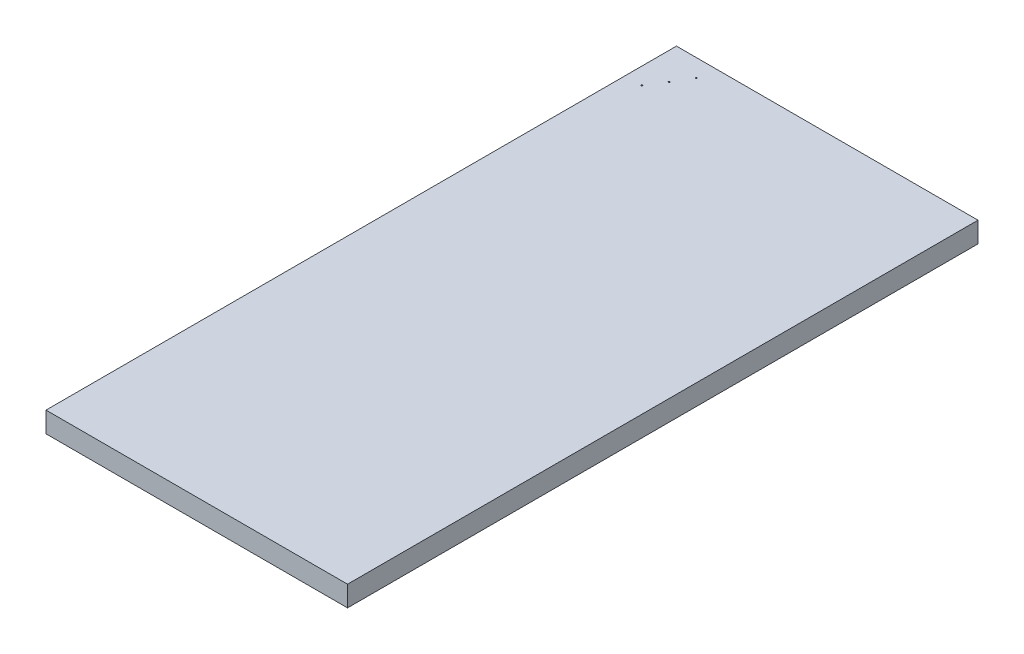
ISO-10303-21;
HEADER;
FILE_DESCRIPTION(('STEP AP214'),'2;1');
FILE_NAME('part.step','',(''),(''),'','','');
FILE_SCHEMA(('AUTOMOTIVE_DESIGN { 1 0 10303 214 1 1 1 1 }'));
ENDSEC;
DATA;
#1=APPLICATION_CONTEXT('core data for automotive mechanical design processes');
#2=APPLICATION_PROTOCOL_DEFINITION('international standard','automotive_design',2000,#1);
#3=PRODUCT_CONTEXT('',#1,'mechanical');
#4=PRODUCT('Part','Part','',(#3));
#5=PRODUCT_RELATED_PRODUCT_CATEGORY('part','',(#4));
#6=PRODUCT_DEFINITION_FORMATION('','',#4);
#7=PRODUCT_DEFINITION_CONTEXT('part definition',#1,'design');
#8=PRODUCT_DEFINITION('design','',#6,#7);
#9=PRODUCT_DEFINITION_SHAPE('','',#8);
#10=(LENGTH_UNIT() NAMED_UNIT(*) SI_UNIT(.MILLI.,.METRE.));
#11=(NAMED_UNIT(*) PLANE_ANGLE_UNIT() SI_UNIT($,.RADIAN.));
#12=(NAMED_UNIT(*) SI_UNIT($,.STERADIAN.) SOLID_ANGLE_UNIT());
#13=UNCERTAINTY_MEASURE_WITH_UNIT(LENGTH_MEASURE(1.E-05),#10,'distance_accuracy_value','');
#14=(GEOMETRIC_REPRESENTATION_CONTEXT(3) GLOBAL_UNCERTAINTY_ASSIGNED_CONTEXT((#13)) GLOBAL_UNIT_ASSIGNED_CONTEXT((#10,
#11,#12)) REPRESENTATION_CONTEXT('',''));
#15=CARTESIAN_POINT('',(0.,0.,0.));
#16=DIRECTION('',(0.,0.,1.));
#17=DIRECTION('',(1.,0.,0.));
#18=AXIS2_PLACEMENT_3D('',#15,#16,#17);
#19=CARTESIAN_POINT('',(-139.28790560472,19.05,-131.252064896755));
#20=DIRECTION('',(1.,0.,0.));
#21=DIRECTION('',(0.,0.,-1.));
#22=AXIS2_PLACEMENT_3D('',#19,#20,#21);
#23=PLANE('',#22);
#24=DIRECTION('',(0.,0.,1.));
#25=VECTOR('',#24,1.);
#26=CARTESIAN_POINT('',(-139.28790560472,0.,-131.252064896755));
#27=LINE('',#26,#25);
#28=CARTESIAN_POINT('',(-139.28790560472,0.,-131.252064896755));
#29=VERTEX_POINT('',#28);
#30=CARTESIAN_POINT('',(-139.28790560472,0.,452.947935103245));
#31=VERTEX_POINT('',#30);
#32=EDGE_CURVE('E102',#29,#31,#27,.T.);
#33=ORIENTED_EDGE('',*,*,#32,.T.);
#34=DIRECTION('',(0.,-1.,0.));
#35=VECTOR('',#34,1.);
#36=CARTESIAN_POINT('',(-139.28790560472,19.05,452.947935103245));
#37=LINE('',#36,#35);
#38=CARTESIAN_POINT('',(-139.28790560472,19.05,452.947935103245));
#39=VERTEX_POINT('',#38);
#40=EDGE_CURVE('E11',#39,#31,#37,.T.);
#41=ORIENTED_EDGE('',*,*,#40,.F.);
#42=DIRECTION('',(0.,0.,1.));
#43=VECTOR('',#42,1.);
#44=CARTESIAN_POINT('',(-139.28790560472,19.05,-131.252064896755));
#45=LINE('',#44,#43);
#46=CARTESIAN_POINT('',(-139.28790560472,19.05,-131.252064896755));
#47=VERTEX_POINT('',#46);
#48=EDGE_CURVE('E90',#47,#39,#45,.T.);
#49=ORIENTED_EDGE('',*,*,#48,.F.);
#50=DIRECTION('',(0.,-1.,0.));
#51=VECTOR('',#50,1.);
#52=CARTESIAN_POINT('',(-139.28790560472,19.05,-131.252064896755));
#53=LINE('',#52,#51);
#54=EDGE_CURVE('E98',#47,#29,#53,.T.);
#55=ORIENTED_EDGE('',*,*,#54,.T.);
#56=EDGE_LOOP('',(#33,#41,#49,#55));
#57=FACE_BOUND('',#56,.T.);
#58=ADVANCED_FACE('F39',(#57),#23,.F.);
#59=CARTESIAN_POINT('',(-139.28790560472,19.05,452.947935103245));
#60=DIRECTION('',(0.,0.,-1.));
#61=DIRECTION('',(-1.,0.,0.));
#62=AXIS2_PLACEMENT_3D('',#59,#60,#61);
#63=PLANE('',#62);
#64=DIRECTION('',(1.,0.,0.));
#65=VECTOR('',#64,1.);
#66=CARTESIAN_POINT('',(-139.28790560472,0.,452.947935103245));
#67=LINE('',#66,#65);
#68=CARTESIAN_POINT('',(140.11209439528,0.,452.947935103245));
#69=VERTEX_POINT('',#68);
#70=EDGE_CURVE('E94',#31,#69,#67,.T.);
#71=ORIENTED_EDGE('',*,*,#70,.T.);
#72=DIRECTION('',(0.,-1.,0.));
#73=VECTOR('',#72,1.);
#74=CARTESIAN_POINT('',(140.11209439528,19.05,452.947935103245));
#75=LINE('',#74,#73);
#76=CARTESIAN_POINT('',(140.11209439528,19.05,452.947935103245));
#77=VERTEX_POINT('',#76);
#78=EDGE_CURVE('E47',#77,#69,#75,.T.);
#79=ORIENTED_EDGE('',*,*,#78,.F.);
#80=DIRECTION('',(1.,0.,0.));
#81=VECTOR('',#80,1.);
#82=CARTESIAN_POINT('',(-139.28790560472,19.05,452.947935103245));
#83=LINE('',#82,#81);
#84=EDGE_CURVE('E85',#39,#77,#83,.T.);
#85=ORIENTED_EDGE('',*,*,#84,.F.);
#86=ORIENTED_EDGE('',*,*,#40,.T.);
#87=EDGE_LOOP('',(#71,#79,#85,#86));
#88=FACE_BOUND('',#87,.T.);
#89=ADVANCED_FACE('F93',(#88),#63,.F.);
#90=CARTESIAN_POINT('',(140.11209439528,19.05,-131.252064896755));
#91=DIRECTION('',(-1.,0.,0.));
#92=DIRECTION('',(0.,0.,1.));
#93=AXIS2_PLACEMENT_3D('',#90,#91,#92);
#94=PLANE('',#93);
#95=DIRECTION('',(0.,0.,-1.));
#96=VECTOR('',#95,1.);
#97=CARTESIAN_POINT('',(140.11209439528,0.,-131.252064896755));
#98=LINE('',#97,#96);
#99=CARTESIAN_POINT('',(140.11209439528,0.,-131.252064896755));
#100=VERTEX_POINT('',#99);
#101=EDGE_CURVE('E72',#69,#100,#98,.T.);
#102=ORIENTED_EDGE('',*,*,#101,.T.);
#103=DIRECTION('',(0.,-1.,0.));
#104=VECTOR('',#103,1.);
#105=CARTESIAN_POINT('',(140.11209439528,19.05,-131.252064896755));
#106=LINE('',#105,#104);
#107=CARTESIAN_POINT('',(140.11209439528,19.05,-131.252064896755));
#108=VERTEX_POINT('',#107);
#109=EDGE_CURVE('E95',#108,#100,#106,.T.);
#110=ORIENTED_EDGE('',*,*,#109,.F.);
#111=DIRECTION('',(0.,0.,-1.));
#112=VECTOR('',#111,1.);
#113=CARTESIAN_POINT('',(140.11209439528,19.05,-131.252064896755));
#114=LINE('',#113,#112);
#115=EDGE_CURVE('E88',#77,#108,#114,.T.);
#116=ORIENTED_EDGE('',*,*,#115,.F.);
#117=ORIENTED_EDGE('',*,*,#78,.T.);
#118=EDGE_LOOP('',(#102,#110,#116,#117));
#119=FACE_BOUND('',#118,.T.);
#120=ADVANCED_FACE('F96',(#119),#94,.F.);
#121=CARTESIAN_POINT('',(-139.28790560472,19.05,-131.252064896755));
#122=DIRECTION('',(0.,0.,1.));
#123=DIRECTION('',(1.,0.,0.));
#124=AXIS2_PLACEMENT_3D('',#121,#122,#123);
#125=PLANE('',#124);
#126=DIRECTION('',(-1.,0.,0.));
#127=VECTOR('',#126,1.);
#128=CARTESIAN_POINT('',(-139.28790560472,0.,-131.252064896755));
#129=LINE('',#128,#127);
#130=EDGE_CURVE('E78',#100,#29,#129,.T.);
#131=ORIENTED_EDGE('',*,*,#130,.T.);
#132=ORIENTED_EDGE('',*,*,#54,.F.);
#133=DIRECTION('',(-1.,0.,0.));
#134=VECTOR('',#133,1.);
#135=CARTESIAN_POINT('',(-139.28790560472,19.05,-131.252064896755));
#136=LINE('',#135,#134);
#137=EDGE_CURVE('E55',#108,#47,#136,.T.);
#138=ORIENTED_EDGE('',*,*,#137,.F.);
#139=ORIENTED_EDGE('',*,*,#109,.T.);
#140=EDGE_LOOP('',(#131,#132,#138,#139));
#141=FACE_BOUND('',#140,.T.);
#142=ADVANCED_FACE('F110',(#141),#125,.F.);
#143=CARTESIAN_POINT('',(0.,19.05,0.));
#144=DIRECTION('',(0.,1.,0.));
#145=DIRECTION('',(0.,0.,1.));
#146=AXIS2_PLACEMENT_3D('',#143,#144,#145);
#147=PLANE('',#146);
#148=CARTESIAN_POINT('',(-104.416850900655,19.05,-114.677411757001));
#149=DIRECTION('',(0.,1.,0.));
#150=DIRECTION('',(0.,0.,1.));
#151=AXIS2_PLACEMENT_3D('',#148,#149,#150);
#152=CIRCLE('',#151,0.635000000000003);
#153=CARTESIAN_POINT('',(-104.416850900655,19.05,-114.042411757001));
#154=VERTEX_POINT('',#153);
#155=EDGE_CURVE('E105',#154,#154,#152,.T.);
#156=ORIENTED_EDGE('',*,*,#155,.F.);
#157=EDGE_LOOP('',(#156));
#158=FACE_BOUND('',#157,.T.);
#159=CARTESIAN_POINT('',(-123.887731017682,19.05,-83.7194696642742));
#160=DIRECTION('',(0.,1.,0.));
#161=DIRECTION('',(0.,0.,1.));
#162=AXIS2_PLACEMENT_3D('',#159,#160,#161);
#163=CIRCLE('',#162,0.635000000000003);
#164=CARTESIAN_POINT('',(-123.887731017682,19.05,-83.0844696642742));
#165=VERTEX_POINT('',#164);
#166=EDGE_CURVE('E118',#165,#165,#163,.T.);
#167=ORIENTED_EDGE('',*,*,#166,.F.);
#168=EDGE_LOOP('',(#167));
#169=FACE_BOUND('',#168,.T.);
#170=CARTESIAN_POINT('',(-113.922633314271,19.05,-99.0539984069996));
#171=DIRECTION('',(0.,1.,0.));
#172=DIRECTION('',(0.,0.,1.));
#173=AXIS2_PLACEMENT_3D('',#170,#171,#172);
#174=CIRCLE('',#173,0.635000000000003);
#175=CARTESIAN_POINT('',(-113.922633314271,19.05,-98.4189984069996));
#176=VERTEX_POINT('',#175);
#177=EDGE_CURVE('E121',#176,#176,#174,.T.);
#178=ORIENTED_EDGE('',*,*,#177,.F.);
#179=EDGE_LOOP('',(#178));
#180=FACE_BOUND('',#179,.T.);
#181=ORIENTED_EDGE('',*,*,#48,.T.);
#182=ORIENTED_EDGE('',*,*,#84,.T.);
#183=ORIENTED_EDGE('',*,*,#115,.T.);
#184=ORIENTED_EDGE('',*,*,#137,.T.);
#185=EDGE_LOOP('',(#181,#182,#183,#184));
#186=FACE_BOUND('',#185,.T.);
#187=ADVANCED_FACE('F86',(#158,#169,#180,#186),#147,.T.);
#188=CARTESIAN_POINT('',(0.,0.,0.));
#189=DIRECTION('',(0.,1.,0.));
#190=DIRECTION('',(0.,0.,1.));
#191=AXIS2_PLACEMENT_3D('',#188,#189,#190);
#192=PLANE('',#191);
#193=CARTESIAN_POINT('',(-104.416850900655,0.,-114.677411757001));
#194=DIRECTION('',(0.,1.,0.));
#195=DIRECTION('',(0.,0.,1.));
#196=AXIS2_PLACEMENT_3D('',#193,#194,#195);
#197=CIRCLE('',#196,0.635000000000003);
#198=CARTESIAN_POINT('',(-104.416850900655,0.,-114.042411757001));
#199=VERTEX_POINT('',#198);
#200=EDGE_CURVE('E124',#199,#199,#197,.T.);
#201=ORIENTED_EDGE('',*,*,#200,.T.);
#202=EDGE_LOOP('',(#201));
#203=FACE_BOUND('',#202,.T.);
#204=CARTESIAN_POINT('',(-123.887731017682,0.,-83.7194696642742));
#205=DIRECTION('',(0.,1.,0.));
#206=DIRECTION('',(0.,0.,1.));
#207=AXIS2_PLACEMENT_3D('',#204,#205,#206);
#208=CIRCLE('',#207,0.635000000000003);
#209=CARTESIAN_POINT('',(-123.887731017682,0.,-83.0844696642742));
#210=VERTEX_POINT('',#209);
#211=EDGE_CURVE('E128',#210,#210,#208,.T.);
#212=ORIENTED_EDGE('',*,*,#211,.T.);
#213=EDGE_LOOP('',(#212));
#214=FACE_BOUND('',#213,.T.);
#215=CARTESIAN_POINT('',(-113.922633314271,0.,-99.0539984069996));
#216=DIRECTION('',(0.,1.,0.));
#217=DIRECTION('',(0.,0.,1.));
#218=AXIS2_PLACEMENT_3D('',#215,#216,#217);
#219=CIRCLE('',#218,0.635000000000003);
#220=CARTESIAN_POINT('',(-113.922633314271,0.,-98.4189984069996));
#221=VERTEX_POINT('',#220);
#222=EDGE_CURVE('E125',#221,#221,#219,.T.);
#223=ORIENTED_EDGE('',*,*,#222,.T.);
#224=EDGE_LOOP('',(#223));
#225=FACE_BOUND('',#224,.T.);
#226=ORIENTED_EDGE('',*,*,#32,.F.);
#227=ORIENTED_EDGE('',*,*,#130,.F.);
#228=ORIENTED_EDGE('',*,*,#101,.F.);
#229=ORIENTED_EDGE('',*,*,#70,.F.);
#230=EDGE_LOOP('',(#226,#227,#228,#229));
#231=FACE_BOUND('',#230,.T.);
#232=ADVANCED_FACE('F113',(#203,#214,#225,#231),#192,.F.);
#233=CARTESIAN_POINT('',(-113.922633314271,0.,-99.0539984069996));
#234=DIRECTION('',(0.,1.,0.));
#235=DIRECTION('',(0.,0.,1.));
#236=AXIS2_PLACEMENT_3D('',#233,#234,#235);
#237=CYLINDRICAL_SURFACE('',#236,0.635000000000003);
#238=ORIENTED_EDGE('',*,*,#177,.T.);
#239=EDGE_LOOP('',(#238));
#240=FACE_BOUND('',#239,.T.);
#241=ORIENTED_EDGE('',*,*,#222,.F.);
#242=EDGE_LOOP('',(#241));
#243=FACE_BOUND('',#242,.T.);
#244=ADVANCED_FACE('F144',(#240,#243),#237,.F.);
#245=CARTESIAN_POINT('',(-123.887731017682,0.,-83.7194696642742));
#246=DIRECTION('',(0.,1.,0.));
#247=DIRECTION('',(0.,0.,1.));
#248=AXIS2_PLACEMENT_3D('',#245,#246,#247);
#249=CYLINDRICAL_SURFACE('',#248,0.635000000000003);
#250=ORIENTED_EDGE('',*,*,#166,.T.);
#251=EDGE_LOOP('',(#250));
#252=FACE_BOUND('',#251,.T.);
#253=ORIENTED_EDGE('',*,*,#211,.F.);
#254=EDGE_LOOP('',(#253));
#255=FACE_BOUND('',#254,.T.);
#256=ADVANCED_FACE('F138',(#252,#255),#249,.F.);
#257=CARTESIAN_POINT('',(-104.416850900655,0.,-114.677411757001));
#258=DIRECTION('',(0.,1.,0.));
#259=DIRECTION('',(0.,0.,1.));
#260=AXIS2_PLACEMENT_3D('',#257,#258,#259);
#261=CYLINDRICAL_SURFACE('',#260,0.635000000000003);
#262=ORIENTED_EDGE('',*,*,#155,.T.);
#263=EDGE_LOOP('',(#262));
#264=FACE_BOUND('',#263,.T.);
#265=ORIENTED_EDGE('',*,*,#200,.F.);
#266=EDGE_LOOP('',(#265));
#267=FACE_BOUND('',#266,.T.);
#268=ADVANCED_FACE('F136',(#264,#267),#261,.F.);
#269=CLOSED_SHELL('',(#58,#89,#120,#142,#187,#232,#244,#256,#268));
#270=MANIFOLD_SOLID_BREP('B2',#269);
#271=ADVANCED_BREP_SHAPE_REPRESENTATION('',(#18,#270),#14);
#272=SHAPE_DEFINITION_REPRESENTATION(#9,#271);
ENDSEC;
END-ISO-10303-21;
